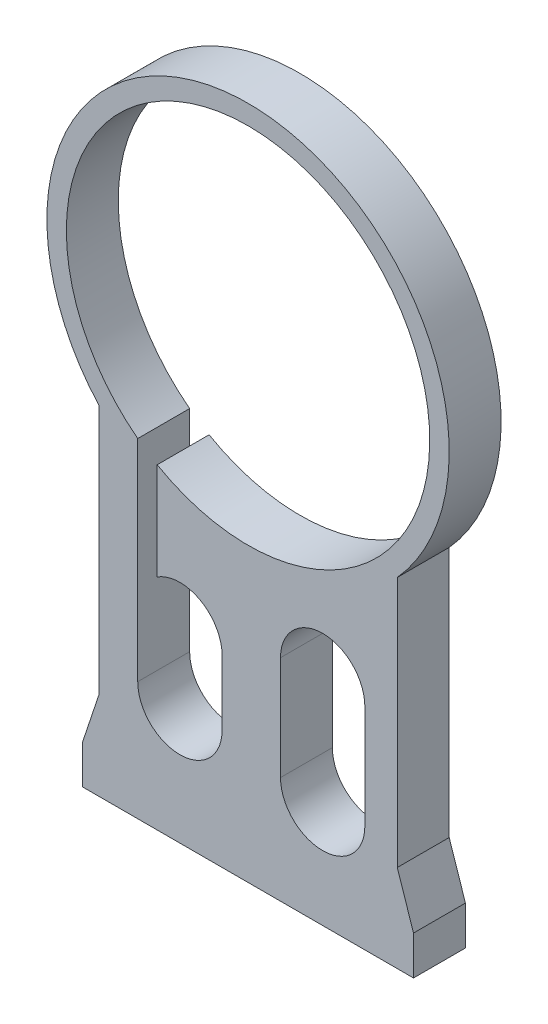
ISO-10303-21;
HEADER;
FILE_DESCRIPTION(('STEP AP214'),'2;1');
FILE_NAME('part.step','',(''),(''),'','','');
FILE_SCHEMA(('AUTOMOTIVE_DESIGN { 1 0 10303 214 1 1 1 1 }'));
ENDSEC;
DATA;
#1=APPLICATION_CONTEXT('core data for automotive mechanical design processes');
#2=APPLICATION_PROTOCOL_DEFINITION('international standard','automotive_design',2000,#1);
#3=PRODUCT_CONTEXT('',#1,'mechanical');
#4=PRODUCT('Part','Part','',(#3));
#5=PRODUCT_RELATED_PRODUCT_CATEGORY('part','',(#4));
#6=PRODUCT_DEFINITION_FORMATION('','',#4);
#7=PRODUCT_DEFINITION_CONTEXT('part definition',#1,'design');
#8=PRODUCT_DEFINITION('design','',#6,#7);
#9=PRODUCT_DEFINITION_SHAPE('','',#8);
#10=(LENGTH_UNIT() NAMED_UNIT(*) SI_UNIT(.MILLI.,.METRE.));
#11=(NAMED_UNIT(*) PLANE_ANGLE_UNIT() SI_UNIT($,.RADIAN.));
#12=(NAMED_UNIT(*) SI_UNIT($,.STERADIAN.) SOLID_ANGLE_UNIT());
#13=UNCERTAINTY_MEASURE_WITH_UNIT(LENGTH_MEASURE(1.E-05),#10,'distance_accuracy_value','');
#14=(GEOMETRIC_REPRESENTATION_CONTEXT(3) GLOBAL_UNCERTAINTY_ASSIGNED_CONTEXT((#13)) GLOBAL_UNIT_ASSIGNED_CONTEXT((#10,
#11,#12)) REPRESENTATION_CONTEXT('',''));
#15=CARTESIAN_POINT('',(0.,0.,0.));
#16=DIRECTION('',(0.,0.,1.));
#17=DIRECTION('',(1.,0.,0.));
#18=AXIS2_PLACEMENT_3D('',#15,#16,#17);
#19=CARTESIAN_POINT('',(0.,36.5,4.));
#20=DIRECTION('',(0.,0.,1.));
#21=DIRECTION('',(1.,0.,0.));
#22=AXIS2_PLACEMENT_3D('',#19,#20,#21);
#23=PLANE('',#22);
#24=DIRECTION('',(0.,-1.,0.));
#25=VECTOR('',#24,1.);
#26=CARTESIAN_POINT('',(-12.75,0.,4.));
#27=LINE('',#26,#25);
#28=CARTESIAN_POINT('',(-12.75,3.,4.));
#29=VERTEX_POINT('',#28);
#30=CARTESIAN_POINT('',(-12.75,0.,4.));
#31=VERTEX_POINT('',#30);
#32=EDGE_CURVE('E239',#29,#31,#27,.T.);
#33=ORIENTED_EDGE('',*,*,#32,.T.);
#34=DIRECTION('',(1.,0.,0.));
#35=VECTOR('',#34,1.);
#36=CARTESIAN_POINT('',(12.75,0.,4.));
#37=LINE('',#36,#35);
#38=CARTESIAN_POINT('',(12.75,0.,4.));
#39=VERTEX_POINT('',#38);
#40=EDGE_CURVE('E242',#31,#39,#37,.T.);
#41=ORIENTED_EDGE('',*,*,#40,.T.);
#42=DIRECTION('',(0.,1.,0.));
#43=VECTOR('',#42,1.);
#44=CARTESIAN_POINT('',(12.75,0.,4.));
#45=LINE('',#44,#43);
#46=CARTESIAN_POINT('',(12.75,3.,4.));
#47=VERTEX_POINT('',#46);
#48=EDGE_CURVE('E245',#39,#47,#45,.T.);
#49=ORIENTED_EDGE('',*,*,#48,.T.);
#50=DIRECTION('',(-0.316227766016838,0.948683298050514,0.));
#51=VECTOR('',#50,1.);
#52=CARTESIAN_POINT('',(12.75,3.,4.));
#53=LINE('',#52,#51);
#54=CARTESIAN_POINT('',(11.5,6.75,4.));
#55=VERTEX_POINT('',#54);
#56=EDGE_CURVE('E247',#47,#55,#53,.T.);
#57=ORIENTED_EDGE('',*,*,#56,.T.);
#58=DIRECTION('',(0.,1.,0.));
#59=VECTOR('',#58,1.);
#60=CARTESIAN_POINT('',(11.5,6.75,4.));
#61=LINE('',#60,#59);
#62=CARTESIAN_POINT('',(11.5,26.1076951545867,4.));
#63=VERTEX_POINT('',#62);
#64=EDGE_CURVE('E249',#55,#63,#61,.T.);
#65=ORIENTED_EDGE('',*,*,#64,.T.);
#66=CARTESIAN_POINT('',(0.,36.5,4.));
#67=DIRECTION('',(0.,0.,1.));
#68=DIRECTION('',(1.,0.,0.));
#69=AXIS2_PLACEMENT_3D('',#66,#67,#68);
#70=CIRCLE('',#69,15.5);
#71=CARTESIAN_POINT('',(-11.5,26.1076951545867,4.));
#72=VERTEX_POINT('',#71);
#73=EDGE_CURVE('E251',#63,#72,#70,.T.);
#74=ORIENTED_EDGE('',*,*,#73,.T.);
#75=DIRECTION('',(0.,-1.,0.));
#76=VECTOR('',#75,1.);
#77=CARTESIAN_POINT('',(-11.5,6.75,4.));
#78=LINE('',#77,#76);
#79=CARTESIAN_POINT('',(-11.5,6.75,4.));
#80=VERTEX_POINT('',#79);
#81=EDGE_CURVE('E253',#72,#80,#78,.T.);
#82=ORIENTED_EDGE('',*,*,#81,.T.);
#83=DIRECTION('',(-0.316227766016838,-0.948683298050514,0.));
#84=VECTOR('',#83,1.);
#85=CARTESIAN_POINT('',(-12.75,3.,4.));
#86=LINE('',#85,#84);
#87=EDGE_CURVE('E255',#80,#29,#86,.T.);
#88=ORIENTED_EDGE('',*,*,#87,.T.);
#89=EDGE_LOOP('',(#33,#41,#49,#57,#65,#74,#82,#88));
#90=FACE_BOUND('',#89,.T.);
#91=DIRECTION('',(0.,1.,0.));
#92=VECTOR('',#91,1.);
#93=CARTESIAN_POINT('',(-7.,16.8886127875258,4.));
#94=LINE('',#93,#92);
#95=CARTESIAN_POINT('',(-7.,16.8886127875258,4.));
#96=VERTEX_POINT('',#95);
#97=CARTESIAN_POINT('',(-7.,24.3756443470179,4.));
#98=VERTEX_POINT('',#97);
#99=EDGE_CURVE('E195',#96,#98,#94,.T.);
#100=ORIENTED_EDGE('',*,*,#99,.F.);
#101=CARTESIAN_POINT('',(-5.25,14.15,4.));
#102=DIRECTION('',(0.,0.,1.));
#103=DIRECTION('',(1.,0.,0.));
#104=AXIS2_PLACEMENT_3D('',#101,#102,#103);
#105=CIRCLE('',#104,3.25);
#106=CARTESIAN_POINT('',(-2.,14.15,4.));
#107=VERTEX_POINT('',#106);
#108=EDGE_CURVE('E193',#107,#96,#105,.T.);
#109=ORIENTED_EDGE('',*,*,#108,.F.);
#110=DIRECTION('',(0.,1.,0.));
#111=VECTOR('',#110,1.);
#112=CARTESIAN_POINT('',(-2.,14.15,4.));
#113=LINE('',#112,#111);
#114=CARTESIAN_POINT('',(-2.,9.15,4.));
#115=VERTEX_POINT('',#114);
#116=EDGE_CURVE('E205',#115,#107,#113,.T.);
#117=ORIENTED_EDGE('',*,*,#116,.F.);
#118=CARTESIAN_POINT('',(-5.25,9.15,4.));
#119=DIRECTION('',(0.,0.,1.));
#120=DIRECTION('',(1.,0.,0.));
#121=AXIS2_PLACEMENT_3D('',#118,#119,#120);
#122=CIRCLE('',#121,3.25);
#123=CARTESIAN_POINT('',(-8.5,9.15,4.));
#124=VERTEX_POINT('',#123);
#125=EDGE_CURVE('E202',#124,#115,#122,.T.);
#126=ORIENTED_EDGE('',*,*,#125,.F.);
#127=DIRECTION('',(0.,-1.,0.));
#128=VECTOR('',#127,1.);
#129=CARTESIAN_POINT('',(-8.5,14.15,4.));
#130=LINE('',#129,#128);
#131=CARTESIAN_POINT('',(-8.49999999999999,25.3757022693565,4.));
#132=VERTEX_POINT('',#131);
#133=EDGE_CURVE('E200',#132,#124,#130,.T.);
#134=ORIENTED_EDGE('',*,*,#133,.F.);
#135=CARTESIAN_POINT('',(0.,36.5,4.));
#136=DIRECTION('',(0.,0.,1.));
#137=DIRECTION('',(1.,0.,0.));
#138=AXIS2_PLACEMENT_3D('',#135,#136,#137);
#139=CIRCLE('',#138,14.);
#140=EDGE_CURVE('E198',#98,#132,#139,.T.);
#141=ORIENTED_EDGE('',*,*,#140,.F.);
#142=EDGE_LOOP('',(#100,#109,#117,#126,#134,#141));
#143=FACE_BOUND('',#142,.T.);
#144=DIRECTION('',(0.,-1.,0.));
#145=VECTOR('',#144,1.);
#146=CARTESIAN_POINT('',(2.5,16.25,4.));
#147=LINE('',#146,#145);
#148=CARTESIAN_POINT('',(2.5,16.25,4.));
#149=VERTEX_POINT('',#148);
#150=CARTESIAN_POINT('',(2.5,8.25,4.));
#151=VERTEX_POINT('',#150);
#152=EDGE_CURVE('E165',#149,#151,#147,.T.);
#153=ORIENTED_EDGE('',*,*,#152,.F.);
#154=CARTESIAN_POINT('',(5.75,16.25,4.));
#155=DIRECTION('',(0.,0.,1.));
#156=DIRECTION('',(1.,0.,0.));
#157=AXIS2_PLACEMENT_3D('',#154,#155,#156);
#158=CIRCLE('',#157,3.25);
#159=CARTESIAN_POINT('',(9.,16.25,4.));
#160=VERTEX_POINT('',#159);
#161=EDGE_CURVE('E157',#160,#149,#158,.T.);
#162=ORIENTED_EDGE('',*,*,#161,.F.);
#163=DIRECTION('',(0.,1.,0.));
#164=VECTOR('',#163,1.);
#165=CARTESIAN_POINT('',(9.,16.25,4.));
#166=LINE('',#165,#164);
#167=CARTESIAN_POINT('',(9.,8.25,4.));
#168=VERTEX_POINT('',#167);
#169=EDGE_CURVE('E179',#168,#160,#166,.T.);
#170=ORIENTED_EDGE('',*,*,#169,.F.);
#171=CARTESIAN_POINT('',(5.75,8.25,4.));
#172=DIRECTION('',(0.,0.,1.));
#173=DIRECTION('',(1.,0.,0.));
#174=AXIS2_PLACEMENT_3D('',#171,#172,#173);
#175=CIRCLE('',#174,3.25);
#176=EDGE_CURVE('E177',#151,#168,#175,.T.);
#177=ORIENTED_EDGE('',*,*,#176,.F.);
#178=EDGE_LOOP('',(#153,#162,#170,#177));
#179=FACE_BOUND('',#178,.T.);
#180=ADVANCED_FACE('F32',(#90,#143,#179),#23,.T.);
#181=CARTESIAN_POINT('',(0.,36.5,0.));
#182=DIRECTION('',(0.,0.,1.));
#183=DIRECTION('',(1.,0.,0.));
#184=AXIS2_PLACEMENT_3D('',#181,#182,#183);
#185=PLANE('',#184);
#186=CARTESIAN_POINT('',(-5.25,14.15,0.));
#187=DIRECTION('',(0.,0.,1.));
#188=DIRECTION('',(1.,0.,0.));
#189=AXIS2_PLACEMENT_3D('',#186,#187,#188);
#190=CIRCLE('',#189,3.25);
#191=CARTESIAN_POINT('',(-2.,14.15,0.));
#192=VERTEX_POINT('',#191);
#193=CARTESIAN_POINT('',(-7.,16.8886127875258,0.));
#194=VERTEX_POINT('',#193);
#195=EDGE_CURVE('E173',#192,#194,#190,.T.);
#196=ORIENTED_EDGE('',*,*,#195,.T.);
#197=DIRECTION('',(0.,1.,0.));
#198=VECTOR('',#197,1.);
#199=CARTESIAN_POINT('',(-7.,16.8886127875258,0.));
#200=LINE('',#199,#198);
#201=CARTESIAN_POINT('',(-7.,24.3756443470179,0.));
#202=VERTEX_POINT('',#201);
#203=EDGE_CURVE('E210',#194,#202,#200,.T.);
#204=ORIENTED_EDGE('',*,*,#203,.T.);
#205=CARTESIAN_POINT('',(0.,36.5,0.));
#206=DIRECTION('',(0.,0.,1.));
#207=DIRECTION('',(1.,0.,0.));
#208=AXIS2_PLACEMENT_3D('',#205,#206,#207);
#209=CIRCLE('',#208,14.);
#210=CARTESIAN_POINT('',(-8.49999999999999,25.3757022693565,0.));
#211=VERTEX_POINT('',#210);
#212=EDGE_CURVE('E213',#202,#211,#209,.T.);
#213=ORIENTED_EDGE('',*,*,#212,.T.);
#214=DIRECTION('',(0.,-1.,0.));
#215=VECTOR('',#214,1.);
#216=CARTESIAN_POINT('',(-8.5,14.15,0.));
#217=LINE('',#216,#215);
#218=CARTESIAN_POINT('',(-8.5,9.15,0.));
#219=VERTEX_POINT('',#218);
#220=EDGE_CURVE('E216',#211,#219,#217,.T.);
#221=ORIENTED_EDGE('',*,*,#220,.T.);
#222=CARTESIAN_POINT('',(-5.25,9.15,0.));
#223=DIRECTION('',(0.,0.,1.));
#224=DIRECTION('',(1.,0.,0.));
#225=AXIS2_PLACEMENT_3D('',#222,#223,#224);
#226=CIRCLE('',#225,3.25);
#227=CARTESIAN_POINT('',(-2.,9.15,0.));
#228=VERTEX_POINT('',#227);
#229=EDGE_CURVE('E219',#219,#228,#226,.T.);
#230=ORIENTED_EDGE('',*,*,#229,.T.);
#231=DIRECTION('',(0.,1.,0.));
#232=VECTOR('',#231,1.);
#233=CARTESIAN_POINT('',(-2.,14.15,0.));
#234=LINE('',#233,#232);
#235=EDGE_CURVE('E196',#228,#192,#234,.T.);
#236=ORIENTED_EDGE('',*,*,#235,.T.);
#237=EDGE_LOOP('',(#196,#204,#213,#221,#230,#236));
#238=FACE_BOUND('',#237,.T.);
#239=DIRECTION('',(0.,-1.,0.));
#240=VECTOR('',#239,1.);
#241=CARTESIAN_POINT('',(-12.75,0.,0.));
#242=LINE('',#241,#240);
#243=CARTESIAN_POINT('',(-12.75,3.,0.));
#244=VERTEX_POINT('',#243);
#245=CARTESIAN_POINT('',(-12.75,0.,0.));
#246=VERTEX_POINT('',#245);
#247=EDGE_CURVE('E238',#244,#246,#242,.T.);
#248=ORIENTED_EDGE('',*,*,#247,.F.);
#249=DIRECTION('',(-0.316227766016838,-0.948683298050514,0.));
#250=VECTOR('',#249,1.);
#251=CARTESIAN_POINT('',(-12.75,3.,0.));
#252=LINE('',#251,#250);
#253=CARTESIAN_POINT('',(-11.5,6.75,0.));
#254=VERTEX_POINT('',#253);
#255=EDGE_CURVE('E243',#254,#244,#252,.T.);
#256=ORIENTED_EDGE('',*,*,#255,.F.);
#257=DIRECTION('',(0.,-1.,0.));
#258=VECTOR('',#257,1.);
#259=CARTESIAN_POINT('',(-11.5,6.75,0.));
#260=LINE('',#259,#258);
#261=CARTESIAN_POINT('',(-11.5,26.1076951545867,0.));
#262=VERTEX_POINT('',#261);
#263=EDGE_CURVE('E270',#262,#254,#260,.T.);
#264=ORIENTED_EDGE('',*,*,#263,.F.);
#265=CARTESIAN_POINT('',(0.,36.5,0.));
#266=DIRECTION('',(0.,0.,1.));
#267=DIRECTION('',(1.,0.,0.));
#268=AXIS2_PLACEMENT_3D('',#265,#266,#267);
#269=CIRCLE('',#268,15.5);
#270=CARTESIAN_POINT('',(11.5,26.1076951545867,0.));
#271=VERTEX_POINT('',#270);
#272=EDGE_CURVE('E268',#271,#262,#269,.T.);
#273=ORIENTED_EDGE('',*,*,#272,.F.);
#274=DIRECTION('',(0.,1.,0.));
#275=VECTOR('',#274,1.);
#276=CARTESIAN_POINT('',(11.5,6.75,0.));
#277=LINE('',#276,#275);
#278=CARTESIAN_POINT('',(11.5,6.75,0.));
#279=VERTEX_POINT('',#278);
#280=EDGE_CURVE('E266',#279,#271,#277,.T.);
#281=ORIENTED_EDGE('',*,*,#280,.F.);
#282=DIRECTION('',(-0.316227766016838,0.948683298050514,0.));
#283=VECTOR('',#282,1.);
#284=CARTESIAN_POINT('',(12.75,3.,0.));
#285=LINE('',#284,#283);
#286=CARTESIAN_POINT('',(12.75,3.,0.));
#287=VERTEX_POINT('',#286);
#288=EDGE_CURVE('E264',#287,#279,#285,.T.);
#289=ORIENTED_EDGE('',*,*,#288,.F.);
#290=DIRECTION('',(0.,1.,0.));
#291=VECTOR('',#290,1.);
#292=CARTESIAN_POINT('',(12.75,0.,0.));
#293=LINE('',#292,#291);
#294=CARTESIAN_POINT('',(12.75,0.,0.));
#295=VERTEX_POINT('',#294);
#296=EDGE_CURVE('E262',#295,#287,#293,.T.);
#297=ORIENTED_EDGE('',*,*,#296,.F.);
#298=DIRECTION('',(1.,0.,0.));
#299=VECTOR('',#298,1.);
#300=CARTESIAN_POINT('',(12.75,0.,0.));
#301=LINE('',#300,#299);
#302=EDGE_CURVE('E260',#246,#295,#301,.T.);
#303=ORIENTED_EDGE('',*,*,#302,.F.);
#304=EDGE_LOOP('',(#248,#256,#264,#273,#281,#289,#297,#303));
#305=FACE_BOUND('',#304,.T.);
#306=CARTESIAN_POINT('',(5.75,16.25,0.));
#307=DIRECTION('',(0.,0.,1.));
#308=DIRECTION('',(1.,0.,0.));
#309=AXIS2_PLACEMENT_3D('',#306,#307,#308);
#310=CIRCLE('',#309,3.25);
#311=CARTESIAN_POINT('',(9.,16.25,0.));
#312=VERTEX_POINT('',#311);
#313=CARTESIAN_POINT('',(2.5,16.25,0.));
#314=VERTEX_POINT('',#313);
#315=EDGE_CURVE('E55',#312,#314,#310,.T.);
#316=ORIENTED_EDGE('',*,*,#315,.T.);
#317=DIRECTION('',(0.,-1.,0.));
#318=VECTOR('',#317,1.);
#319=CARTESIAN_POINT('',(2.5,16.25,0.));
#320=LINE('',#319,#318);
#321=CARTESIAN_POINT('',(2.5,8.25,0.));
#322=VERTEX_POINT('',#321);
#323=EDGE_CURVE('E172',#314,#322,#320,.T.);
#324=ORIENTED_EDGE('',*,*,#323,.T.);
#325=CARTESIAN_POINT('',(5.75,8.25,0.));
#326=DIRECTION('',(0.,0.,1.));
#327=DIRECTION('',(1.,0.,0.));
#328=AXIS2_PLACEMENT_3D('',#325,#326,#327);
#329=CIRCLE('',#328,3.25);
#330=CARTESIAN_POINT('',(9.,8.25,0.));
#331=VERTEX_POINT('',#330);
#332=EDGE_CURVE('E185',#322,#331,#329,.T.);
#333=ORIENTED_EDGE('',*,*,#332,.T.);
#334=DIRECTION('',(0.,1.,0.));
#335=VECTOR('',#334,1.);
#336=CARTESIAN_POINT('',(9.,16.25,0.));
#337=LINE('',#336,#335);
#338=EDGE_CURVE('E166',#331,#312,#337,.T.);
#339=ORIENTED_EDGE('',*,*,#338,.T.);
#340=EDGE_LOOP('',(#316,#324,#333,#339));
#341=FACE_BOUND('',#340,.T.);
#342=ADVANCED_FACE('F300',(#238,#305,#341),#185,.F.);
#343=CARTESIAN_POINT('',(-12.75,0.,4.));
#344=DIRECTION('',(1.,0.,0.));
#345=DIRECTION('',(0.,0.,-1.));
#346=AXIS2_PLACEMENT_3D('',#343,#344,#345);
#347=PLANE('',#346);
#348=ORIENTED_EDGE('',*,*,#247,.T.);
#349=DIRECTION('',(0.,0.,-1.));
#350=VECTOR('',#349,1.);
#351=CARTESIAN_POINT('',(-12.75,0.,4.));
#352=LINE('',#351,#350);
#353=EDGE_CURVE('E11',#31,#246,#352,.T.);
#354=ORIENTED_EDGE('',*,*,#353,.F.);
#355=ORIENTED_EDGE('',*,*,#32,.F.);
#356=DIRECTION('',(0.,0.,-1.));
#357=VECTOR('',#356,1.);
#358=CARTESIAN_POINT('',(-12.75,3.,4.));
#359=LINE('',#358,#357);
#360=EDGE_CURVE('E257',#29,#244,#359,.T.);
#361=ORIENTED_EDGE('',*,*,#360,.T.);
#362=EDGE_LOOP('',(#348,#354,#355,#361));
#363=FACE_BOUND('',#362,.T.);
#364=ADVANCED_FACE('F34',(#363),#347,.F.);
#365=CARTESIAN_POINT('',(12.75,0.,4.));
#366=DIRECTION('',(0.,1.,0.));
#367=DIRECTION('',(-1.,0.,0.));
#368=AXIS2_PLACEMENT_3D('',#365,#366,#367);
#369=PLANE('',#368);
#370=ORIENTED_EDGE('',*,*,#302,.T.);
#371=DIRECTION('',(0.,0.,-1.));
#372=VECTOR('',#371,1.);
#373=CARTESIAN_POINT('',(12.75,0.,4.));
#374=LINE('',#373,#372);
#375=EDGE_CURVE('E40',#39,#295,#374,.T.);
#376=ORIENTED_EDGE('',*,*,#375,.F.);
#377=ORIENTED_EDGE('',*,*,#40,.F.);
#378=ORIENTED_EDGE('',*,*,#353,.T.);
#379=EDGE_LOOP('',(#370,#376,#377,#378));
#380=FACE_BOUND('',#379,.T.);
#381=ADVANCED_FACE('F318',(#380),#369,.F.);
#382=CARTESIAN_POINT('',(12.75,0.,4.));
#383=DIRECTION('',(-1.,0.,0.));
#384=DIRECTION('',(0.,0.,1.));
#385=AXIS2_PLACEMENT_3D('',#382,#383,#384);
#386=PLANE('',#385);
#387=ORIENTED_EDGE('',*,*,#296,.T.);
#388=DIRECTION('',(0.,0.,-1.));
#389=VECTOR('',#388,1.);
#390=CARTESIAN_POINT('',(12.75,3.,4.));
#391=LINE('',#390,#389);
#392=EDGE_CURVE('E287',#47,#287,#391,.T.);
#393=ORIENTED_EDGE('',*,*,#392,.F.);
#394=ORIENTED_EDGE('',*,*,#48,.F.);
#395=ORIENTED_EDGE('',*,*,#375,.T.);
#396=EDGE_LOOP('',(#387,#393,#394,#395));
#397=FACE_BOUND('',#396,.T.);
#398=ADVANCED_FACE('F294',(#397),#386,.F.);
#399=CARTESIAN_POINT('',(12.75,3.,4.));
#400=DIRECTION('',(-0.948683298050514,-0.316227766016838,0.));
#401=DIRECTION('',(0.316227766016838,-0.948683298050514,0.));
#402=AXIS2_PLACEMENT_3D('',#399,#400,#401);
#403=PLANE('',#402);
#404=ORIENTED_EDGE('',*,*,#288,.T.);
#405=DIRECTION('',(0.,0.,-1.));
#406=VECTOR('',#405,1.);
#407=CARTESIAN_POINT('',(11.5,6.75,4.));
#408=LINE('',#407,#406);
#409=EDGE_CURVE('E284',#55,#279,#408,.T.);
#410=ORIENTED_EDGE('',*,*,#409,.F.);
#411=ORIENTED_EDGE('',*,*,#56,.F.);
#412=ORIENTED_EDGE('',*,*,#392,.T.);
#413=EDGE_LOOP('',(#404,#410,#411,#412));
#414=FACE_BOUND('',#413,.T.);
#415=ADVANCED_FACE('F306',(#414),#403,.F.);
#416=CARTESIAN_POINT('',(11.5,6.75,4.));
#417=DIRECTION('',(-1.,0.,0.));
#418=DIRECTION('',(0.,0.,1.));
#419=AXIS2_PLACEMENT_3D('',#416,#417,#418);
#420=PLANE('',#419);
#421=ORIENTED_EDGE('',*,*,#280,.T.);
#422=DIRECTION('',(0.,0.,-1.));
#423=VECTOR('',#422,1.);
#424=CARTESIAN_POINT('',(11.5,26.1076951545867,4.));
#425=LINE('',#424,#423);
#426=EDGE_CURVE('E281',#63,#271,#425,.T.);
#427=ORIENTED_EDGE('',*,*,#426,.F.);
#428=ORIENTED_EDGE('',*,*,#64,.F.);
#429=ORIENTED_EDGE('',*,*,#409,.T.);
#430=EDGE_LOOP('',(#421,#427,#428,#429));
#431=FACE_BOUND('',#430,.T.);
#432=ADVANCED_FACE('F310',(#431),#420,.F.);
#433=CARTESIAN_POINT('',(0.,36.5,4.));
#434=DIRECTION('',(0.,0.,-1.));
#435=DIRECTION('',(-1.,0.,0.));
#436=AXIS2_PLACEMENT_3D('',#433,#434,#435);
#437=CYLINDRICAL_SURFACE('',#436,15.5);
#438=ORIENTED_EDGE('',*,*,#272,.T.);
#439=DIRECTION('',(0.,0.,-1.));
#440=VECTOR('',#439,1.);
#441=CARTESIAN_POINT('',(-11.5,26.1076951545867,4.));
#442=LINE('',#441,#440);
#443=EDGE_CURVE('E278',#72,#262,#442,.T.);
#444=ORIENTED_EDGE('',*,*,#443,.F.);
#445=ORIENTED_EDGE('',*,*,#73,.F.);
#446=ORIENTED_EDGE('',*,*,#426,.T.);
#447=EDGE_LOOP('',(#438,#444,#445,#446));
#448=FACE_BOUND('',#447,.T.);
#449=ADVANCED_FACE('F331',(#448),#437,.T.);
#450=CARTESIAN_POINT('',(-11.5,6.75,4.));
#451=DIRECTION('',(1.,0.,0.));
#452=DIRECTION('',(0.,0.,-1.));
#453=AXIS2_PLACEMENT_3D('',#450,#451,#452);
#454=PLANE('',#453);
#455=ORIENTED_EDGE('',*,*,#263,.T.);
#456=DIRECTION('',(0.,0.,-1.));
#457=VECTOR('',#456,1.);
#458=CARTESIAN_POINT('',(-11.5,6.75,4.));
#459=LINE('',#458,#457);
#460=EDGE_CURVE('E275',#80,#254,#459,.T.);
#461=ORIENTED_EDGE('',*,*,#460,.F.);
#462=ORIENTED_EDGE('',*,*,#81,.F.);
#463=ORIENTED_EDGE('',*,*,#443,.T.);
#464=EDGE_LOOP('',(#455,#461,#462,#463));
#465=FACE_BOUND('',#464,.T.);
#466=ADVANCED_FACE('F329',(#465),#454,.F.);
#467=CARTESIAN_POINT('',(-12.75,3.,4.));
#468=DIRECTION('',(0.948683298050514,-0.316227766016838,0.));
#469=DIRECTION('',(0.316227766016838,0.948683298050514,0.));
#470=AXIS2_PLACEMENT_3D('',#467,#468,#469);
#471=PLANE('',#470);
#472=ORIENTED_EDGE('',*,*,#255,.T.);
#473=ORIENTED_EDGE('',*,*,#360,.F.);
#474=ORIENTED_EDGE('',*,*,#87,.F.);
#475=ORIENTED_EDGE('',*,*,#460,.T.);
#476=EDGE_LOOP('',(#472,#473,#474,#475));
#477=FACE_BOUND('',#476,.T.);
#478=ADVANCED_FACE('F324',(#477),#471,.F.);
#479=CARTESIAN_POINT('',(-5.25,14.15,4.));
#480=DIRECTION('',(0.,0.,-1.));
#481=DIRECTION('',(-1.,0.,0.));
#482=AXIS2_PLACEMENT_3D('',#479,#480,#481);
#483=CYLINDRICAL_SURFACE('',#482,3.25);
#484=ORIENTED_EDGE('',*,*,#195,.F.);
#485=DIRECTION('',(0.,0.,-1.));
#486=VECTOR('',#485,1.);
#487=CARTESIAN_POINT('',(-2.,14.15,4.));
#488=LINE('',#487,#486);
#489=EDGE_CURVE('E207',#107,#192,#488,.T.);
#490=ORIENTED_EDGE('',*,*,#489,.F.);
#491=ORIENTED_EDGE('',*,*,#108,.T.);
#492=DIRECTION('',(0.,0.,-1.));
#493=VECTOR('',#492,1.);
#494=CARTESIAN_POINT('',(-7.,16.8886127875258,4.));
#495=LINE('',#494,#493);
#496=EDGE_CURVE('E235',#96,#194,#495,.T.);
#497=ORIENTED_EDGE('',*,*,#496,.T.);
#498=EDGE_LOOP('',(#484,#490,#491,#497));
#499=FACE_BOUND('',#498,.T.);
#500=ADVANCED_FACE('F348',(#499),#483,.F.);
#501=CARTESIAN_POINT('',(-7.,16.8886127875258,4.));
#502=DIRECTION('',(-1.,0.,0.));
#503=DIRECTION('',(0.,0.,1.));
#504=AXIS2_PLACEMENT_3D('',#501,#502,#503);
#505=PLANE('',#504);
#506=ORIENTED_EDGE('',*,*,#203,.F.);
#507=ORIENTED_EDGE('',*,*,#496,.F.);
#508=ORIENTED_EDGE('',*,*,#99,.T.);
#509=DIRECTION('',(0.,0.,-1.));
#510=VECTOR('',#509,1.);
#511=CARTESIAN_POINT('',(-7.,24.3756443470179,4.));
#512=LINE('',#511,#510);
#513=EDGE_CURVE('E233',#98,#202,#512,.T.);
#514=ORIENTED_EDGE('',*,*,#513,.T.);
#515=EDGE_LOOP('',(#506,#507,#508,#514));
#516=FACE_BOUND('',#515,.T.);
#517=ADVANCED_FACE('F355',(#516),#505,.T.);
#518=CARTESIAN_POINT('',(0.,36.5,4.));
#519=DIRECTION('',(0.,0.,-1.));
#520=DIRECTION('',(-1.,0.,0.));
#521=AXIS2_PLACEMENT_3D('',#518,#519,#520);
#522=CYLINDRICAL_SURFACE('',#521,14.);
#523=ORIENTED_EDGE('',*,*,#212,.F.);
#524=ORIENTED_EDGE('',*,*,#513,.F.);
#525=ORIENTED_EDGE('',*,*,#140,.T.);
#526=DIRECTION('',(0.,0.,-1.));
#527=VECTOR('',#526,1.);
#528=CARTESIAN_POINT('',(-8.49999999999999,25.3757022693565,4.));
#529=LINE('',#528,#527);
#530=EDGE_CURVE('E230',#132,#211,#529,.T.);
#531=ORIENTED_EDGE('',*,*,#530,.T.);
#532=EDGE_LOOP('',(#523,#524,#525,#531));
#533=FACE_BOUND('',#532,.T.);
#534=ADVANCED_FACE('F360',(#533),#522,.F.);
#535=CARTESIAN_POINT('',(-8.5,14.15,4.));
#536=DIRECTION('',(1.,0.,0.));
#537=DIRECTION('',(0.,0.,-1.));
#538=AXIS2_PLACEMENT_3D('',#535,#536,#537);
#539=PLANE('',#538);
#540=ORIENTED_EDGE('',*,*,#220,.F.);
#541=ORIENTED_EDGE('',*,*,#530,.F.);
#542=ORIENTED_EDGE('',*,*,#133,.T.);
#543=DIRECTION('',(0.,0.,-1.));
#544=VECTOR('',#543,1.);
#545=CARTESIAN_POINT('',(-8.5,9.15,4.));
#546=LINE('',#545,#544);
#547=EDGE_CURVE('E228',#124,#219,#546,.T.);
#548=ORIENTED_EDGE('',*,*,#547,.T.);
#549=EDGE_LOOP('',(#540,#541,#542,#548));
#550=FACE_BOUND('',#549,.T.);
#551=ADVANCED_FACE('F382',(#550),#539,.T.);
#552=CARTESIAN_POINT('',(-5.25,9.15,4.));
#553=DIRECTION('',(0.,0.,-1.));
#554=DIRECTION('',(-1.,0.,0.));
#555=AXIS2_PLACEMENT_3D('',#552,#553,#554);
#556=CYLINDRICAL_SURFACE('',#555,3.25);
#557=ORIENTED_EDGE('',*,*,#229,.F.);
#558=ORIENTED_EDGE('',*,*,#547,.F.);
#559=ORIENTED_EDGE('',*,*,#125,.T.);
#560=DIRECTION('',(0.,0.,-1.));
#561=VECTOR('',#560,1.);
#562=CARTESIAN_POINT('',(-2.,9.15,4.));
#563=LINE('',#562,#561);
#564=EDGE_CURVE('E226',#115,#228,#563,.T.);
#565=ORIENTED_EDGE('',*,*,#564,.T.);
#566=EDGE_LOOP('',(#557,#558,#559,#565));
#567=FACE_BOUND('',#566,.T.);
#568=ADVANCED_FACE('F372',(#567),#556,.F.);
#569=CARTESIAN_POINT('',(-2.,14.15,4.));
#570=DIRECTION('',(-1.,0.,0.));
#571=DIRECTION('',(0.,-1.,0.));
#572=AXIS2_PLACEMENT_3D('',#569,#570,#571);
#573=PLANE('',#572);
#574=ORIENTED_EDGE('',*,*,#235,.F.);
#575=ORIENTED_EDGE('',*,*,#564,.F.);
#576=ORIENTED_EDGE('',*,*,#116,.T.);
#577=ORIENTED_EDGE('',*,*,#489,.T.);
#578=EDGE_LOOP('',(#574,#575,#576,#577));
#579=FACE_BOUND('',#578,.T.);
#580=ADVANCED_FACE('F367',(#579),#573,.T.);
#581=CARTESIAN_POINT('',(5.75,16.25,4.));
#582=DIRECTION('',(0.,0.,-1.));
#583=DIRECTION('',(-1.,0.,0.));
#584=AXIS2_PLACEMENT_3D('',#581,#582,#583);
#585=CYLINDRICAL_SURFACE('',#584,3.25);
#586=ORIENTED_EDGE('',*,*,#315,.F.);
#587=DIRECTION('',(0.,0.,-1.));
#588=VECTOR('',#587,1.);
#589=CARTESIAN_POINT('',(9.,16.25,4.));
#590=LINE('',#589,#588);
#591=EDGE_CURVE('E161',#160,#312,#590,.T.);
#592=ORIENTED_EDGE('',*,*,#591,.F.);
#593=ORIENTED_EDGE('',*,*,#161,.T.);
#594=DIRECTION('',(0.,0.,-1.));
#595=VECTOR('',#594,1.);
#596=CARTESIAN_POINT('',(2.5,16.25,4.));
#597=LINE('',#596,#595);
#598=EDGE_CURVE('E160',#149,#314,#597,.T.);
#599=ORIENTED_EDGE('',*,*,#598,.T.);
#600=EDGE_LOOP('',(#586,#592,#593,#599));
#601=FACE_BOUND('',#600,.T.);
#602=ADVANCED_FACE('F159',(#601),#585,.F.);
#603=CARTESIAN_POINT('',(2.5,16.25,4.));
#604=DIRECTION('',(1.,0.,0.));
#605=DIRECTION('',(0.,1.,0.));
#606=AXIS2_PLACEMENT_3D('',#603,#604,#605);
#607=PLANE('',#606);
#608=ORIENTED_EDGE('',*,*,#323,.F.);
#609=ORIENTED_EDGE('',*,*,#598,.F.);
#610=ORIENTED_EDGE('',*,*,#152,.T.);
#611=DIRECTION('',(0.,0.,-1.));
#612=VECTOR('',#611,1.);
#613=CARTESIAN_POINT('',(2.5,8.25,4.));
#614=LINE('',#613,#612);
#615=EDGE_CURVE('E174',#151,#322,#614,.T.);
#616=ORIENTED_EDGE('',*,*,#615,.T.);
#617=EDGE_LOOP('',(#608,#609,#610,#616));
#618=FACE_BOUND('',#617,.T.);
#619=ADVANCED_FACE('F169',(#618),#607,.T.);
#620=CARTESIAN_POINT('',(5.75,8.25,4.));
#621=DIRECTION('',(0.,0.,-1.));
#622=DIRECTION('',(-1.,0.,0.));
#623=AXIS2_PLACEMENT_3D('',#620,#621,#622);
#624=CYLINDRICAL_SURFACE('',#623,3.25);
#625=ORIENTED_EDGE('',*,*,#332,.F.);
#626=ORIENTED_EDGE('',*,*,#615,.F.);
#627=ORIENTED_EDGE('',*,*,#176,.T.);
#628=DIRECTION('',(0.,0.,-1.));
#629=VECTOR('',#628,1.);
#630=CARTESIAN_POINT('',(9.,8.25,4.));
#631=LINE('',#630,#629);
#632=EDGE_CURVE('E47',#168,#331,#631,.T.);
#633=ORIENTED_EDGE('',*,*,#632,.T.);
#634=EDGE_LOOP('',(#625,#626,#627,#633));
#635=FACE_BOUND('',#634,.T.);
#636=ADVANCED_FACE('F398',(#635),#624,.F.);
#637=CARTESIAN_POINT('',(9.,16.25,4.));
#638=DIRECTION('',(-1.,0.,0.));
#639=DIRECTION('',(0.,-1.,0.));
#640=AXIS2_PLACEMENT_3D('',#637,#638,#639);
#641=PLANE('',#640);
#642=ORIENTED_EDGE('',*,*,#338,.F.);
#643=ORIENTED_EDGE('',*,*,#632,.F.);
#644=ORIENTED_EDGE('',*,*,#169,.T.);
#645=ORIENTED_EDGE('',*,*,#591,.T.);
#646=EDGE_LOOP('',(#642,#643,#644,#645));
#647=FACE_BOUND('',#646,.T.);
#648=ADVANCED_FACE('F401',(#647),#641,.T.);
#649=CLOSED_SHELL('',(#180,#342,#364,#381,#398,#415,#432,#449,#466,#478,#500,#517,#534,#551,
#568,#580,#602,#619,#636,#648));
#650=MANIFOLD_SOLID_BREP('B2',#649);
#651=ADVANCED_BREP_SHAPE_REPRESENTATION('',(#18,#650),#14);
#652=SHAPE_DEFINITION_REPRESENTATION(#9,#651);
ENDSEC;
END-ISO-10303-21;
